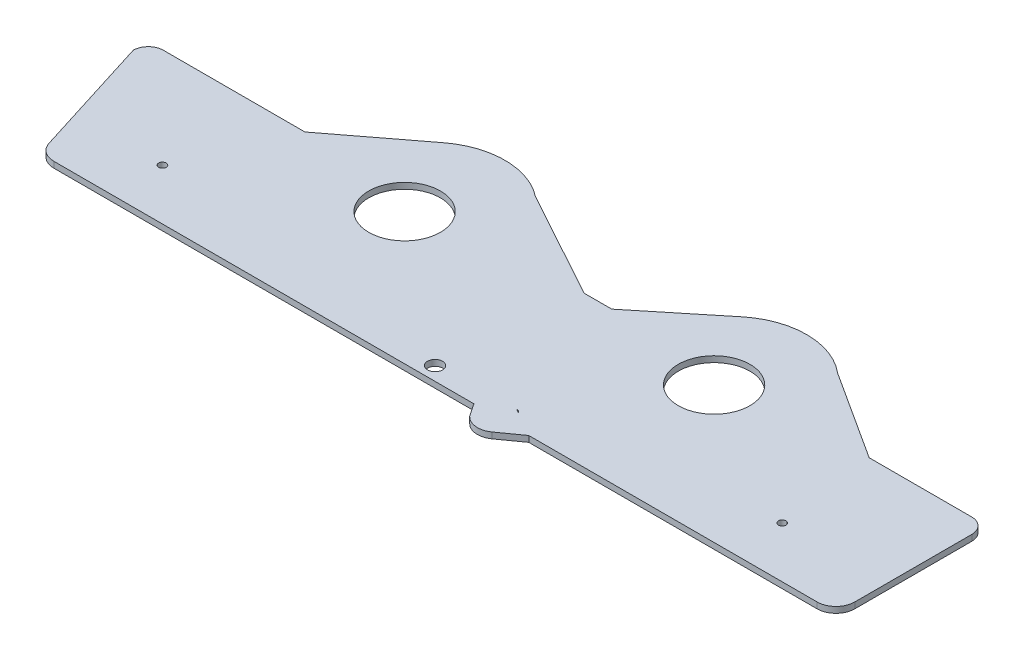
ISO-10303-21;
HEADER;
FILE_DESCRIPTION(('STEP AP214'),'2;1');
FILE_NAME('part.step','',(''),(''),'','','');
FILE_SCHEMA(('AUTOMOTIVE_DESIGN { 1 0 10303 214 1 1 1 1 }'));
ENDSEC;
DATA;
#1=APPLICATION_CONTEXT('core data for automotive mechanical design processes');
#2=APPLICATION_PROTOCOL_DEFINITION('international standard','automotive_design',2000,#1);
#3=PRODUCT_CONTEXT('',#1,'mechanical');
#4=PRODUCT('Part','Part','',(#3));
#5=PRODUCT_RELATED_PRODUCT_CATEGORY('part','',(#4));
#6=PRODUCT_DEFINITION_FORMATION('','',#4);
#7=PRODUCT_DEFINITION_CONTEXT('part definition',#1,'design');
#8=PRODUCT_DEFINITION('design','',#6,#7);
#9=PRODUCT_DEFINITION_SHAPE('','',#8);
#10=(LENGTH_UNIT() NAMED_UNIT(*) SI_UNIT(.MILLI.,.METRE.));
#11=(NAMED_UNIT(*) PLANE_ANGLE_UNIT() SI_UNIT($,.RADIAN.));
#12=(NAMED_UNIT(*) SI_UNIT($,.STERADIAN.) SOLID_ANGLE_UNIT());
#13=UNCERTAINTY_MEASURE_WITH_UNIT(LENGTH_MEASURE(1.E-05),#10,'distance_accuracy_value','');
#14=(GEOMETRIC_REPRESENTATION_CONTEXT(3) GLOBAL_UNCERTAINTY_ASSIGNED_CONTEXT((#13)) GLOBAL_UNIT_ASSIGNED_CONTEXT((#10,
#11,#12)) REPRESENTATION_CONTEXT('',''));
#15=CARTESIAN_POINT('',(0.,0.,0.));
#16=DIRECTION('',(0.,0.,1.));
#17=DIRECTION('',(1.,0.,0.));
#18=AXIS2_PLACEMENT_3D('',#15,#16,#17);
#19=CARTESIAN_POINT('',(264.5,0.,-70.));
#20=DIRECTION('',(0.,1.,0.));
#21=DIRECTION('',(0.,0.,1.));
#22=AXIS2_PLACEMENT_3D('',#19,#20,#21);
#23=CYLINDRICAL_SURFACE('',#22,10.);
#24=DIRECTION('',(0.,1.,0.));
#25=VECTOR('',#24,1.);
#26=CARTESIAN_POINT('',(270.323640372309,0.,-61.8707188009016));
#27=LINE('',#26,#25);
#28=CARTESIAN_POINT('',(270.323640372309,0.,-61.8707188009016));
#29=VERTEX_POINT('',#28);
#30=CARTESIAN_POINT('',(270.323640372309,3.175,-61.8707188009016));
#31=VERTEX_POINT('',#30);
#32=EDGE_CURVE('E215',#29,#31,#27,.T.);
#33=ORIENTED_EDGE('',*,*,#32,.T.);
#34=CARTESIAN_POINT('',(264.5,3.175,-70.));
#35=DIRECTION('',(0.,1.,0.));
#36=DIRECTION('',(0.,0.,1.));
#37=AXIS2_PLACEMENT_3D('',#34,#35,#36);
#38=CIRCLE('',#37,10.);
#39=CARTESIAN_POINT('',(257.164027826321,3.175,-63.204154779058));
#40=VERTEX_POINT('',#39);
#41=EDGE_CURVE('E58',#31,#40,#38,.F.);
#42=ORIENTED_EDGE('',*,*,#41,.T.);
#43=DIRECTION('',(0.,1.,0.));
#44=VECTOR('',#43,1.);
#45=CARTESIAN_POINT('',(257.164027826321,0.,-63.204154779058));
#46=LINE('',#45,#44);
#47=CARTESIAN_POINT('',(257.164027826321,0.,-63.204154779058));
#48=VERTEX_POINT('',#47);
#49=EDGE_CURVE('E230',#48,#40,#46,.T.);
#50=ORIENTED_EDGE('',*,*,#49,.F.);
#51=CARTESIAN_POINT('',(264.5,0.,-70.));
#52=DIRECTION('',(0.,1.,0.));
#53=DIRECTION('',(0.,0.,1.));
#54=AXIS2_PLACEMENT_3D('',#51,#52,#53);
#55=CIRCLE('',#54,10.);
#56=EDGE_CURVE('E538',#48,#29,#55,.T.);
#57=ORIENTED_EDGE('',*,*,#56,.T.);
#58=EDGE_LOOP('',(#33,#42,#50,#57));
#59=FACE_BOUND('',#58,.T.);
#60=ADVANCED_FACE('F43',(#59),#23,.T.);
#61=CARTESIAN_POINT('',(206.258119686764,0.,-138.832894737649));
#62=DIRECTION('',(-0.82957784665794,0.,0.558391078308362));
#63=DIRECTION('',(0.558391078308362,0.,0.82957784665794));
#64=AXIS2_PLACEMENT_3D('',#61,#62,#63);
#65=PLANE('',#64);
#66=ORIENTED_EDGE('',*,*,#49,.T.);
#67=DIRECTION('',(-0.558391078308362,0.,-0.82957784665794));
#68=VECTOR('',#67,1.);
#69=CARTESIAN_POINT('',(206.258119686764,3.175,-138.832894737649));
#70=LINE('',#69,#68);
#71=CARTESIAN_POINT('',(252.589726142366,3.175,-70.));
#72=VERTEX_POINT('',#71);
#73=EDGE_CURVE('E464',#40,#72,#70,.T.);
#74=ORIENTED_EDGE('',*,*,#73,.T.);
#75=DIRECTION('',(0.,1.,0.));
#76=VECTOR('',#75,1.);
#77=CARTESIAN_POINT('',(252.589726142366,0.,-70.));
#78=LINE('',#77,#76);
#79=CARTESIAN_POINT('',(252.589726142366,0.,-70.));
#80=VERTEX_POINT('',#79);
#81=EDGE_CURVE('E521',#80,#72,#78,.T.);
#82=ORIENTED_EDGE('',*,*,#81,.F.);
#83=DIRECTION('',(0.558391078308362,0.,0.82957784665794));
#84=VECTOR('',#83,1.);
#85=CARTESIAN_POINT('',(206.258119686764,0.,-138.832894737649));
#86=LINE('',#85,#84);
#87=EDGE_CURVE('E221',#80,#48,#86,.T.);
#88=ORIENTED_EDGE('',*,*,#87,.T.);
#89=EDGE_LOOP('',(#66,#74,#82,#88));
#90=FACE_BOUND('',#89,.T.);
#91=ADVANCED_FACE('F442',(#90),#65,.T.);
#92=CARTESIAN_POINT('',(101.776463936064,0.,-174.764335414678));
#93=DIRECTION('',(-0.503245940608634,0.,0.864143230755718));
#94=DIRECTION('',(0.864143230755718,0.,0.503245940608634));
#95=AXIS2_PLACEMENT_3D('',#92,#93,#94);
#96=PLANE('',#95);
#97=DIRECTION('',(-0.864143230755718,0.,-0.503245940608634));
#98=VECTOR('',#97,1.);
#99=CARTESIAN_POINT('',(101.776463936064,3.175,-174.764335414678));
#100=LINE('',#99,#98);
#101=CARTESIAN_POINT('',(268.849345076715,3.175,-77.4670978418141));
#102=VERTEX_POINT('',#101);
#103=CARTESIAN_POINT('',(266.045546336288,3.175,-79.0999293958723));
#104=VERTEX_POINT('',#103);
#105=EDGE_CURVE('E459',#102,#104,#100,.T.);
#106=ORIENTED_EDGE('',*,*,#105,.F.);
#107=DIRECTION('',(0.,1.,0.));
#108=VECTOR('',#107,1.);
#109=CARTESIAN_POINT('',(268.849345076715,0.,-77.4670978418142));
#110=LINE('',#109,#108);
#111=CARTESIAN_POINT('',(268.849345076715,0.,-77.4670978418141));
#112=VERTEX_POINT('',#111);
#113=EDGE_CURVE('E214',#112,#102,#110,.T.);
#114=ORIENTED_EDGE('',*,*,#113,.F.);
#115=DIRECTION('',(0.864143230755718,0.,0.503245940608634));
#116=VECTOR('',#115,1.);
#117=CARTESIAN_POINT('',(101.776463936064,0.,-174.764335414678));
#118=LINE('',#117,#116);
#119=CARTESIAN_POINT('',(266.045546336288,0.,-79.0999293958722));
#120=VERTEX_POINT('',#119);
#121=EDGE_CURVE('E540',#120,#112,#118,.T.);
#122=ORIENTED_EDGE('',*,*,#121,.F.);
#123=DIRECTION('',(0.,1.,0.));
#124=VECTOR('',#123,1.);
#125=CARTESIAN_POINT('',(266.045546336288,0.,-79.0999293958723));
#126=LINE('',#125,#124);
#127=EDGE_CURVE('E66',#120,#104,#126,.T.);
#128=ORIENTED_EDGE('',*,*,#127,.T.);
#129=EDGE_LOOP('',(#106,#114,#122,#128));
#130=FACE_BOUND('',#129,.T.);
#131=ADVANCED_FACE('F447',(#130),#96,.F.);
#132=CARTESIAN_POINT('',(62.3888453469937,0.,87.0892491789818));
#133=DIRECTION('',(-0.582364037230876,0.,-0.812928119909844));
#134=DIRECTION('',(-0.812928119909844,0.,0.582364037230876));
#135=AXIS2_PLACEMENT_3D('',#132,#133,#134);
#136=PLANE('',#135);
#137=DIRECTION('',(0.812928119909844,0.,-0.582364037230876));
#138=VECTOR('',#137,1.);
#139=CARTESIAN_POINT('',(62.3888453469937,3.175,87.0892491789818));
#140=LINE('',#139,#138);
#141=CARTESIAN_POINT('',(281.671389990958,3.175,-70.));
#142=VERTEX_POINT('',#141);
#143=EDGE_CURVE('E11',#31,#142,#140,.T.);
#144=ORIENTED_EDGE('',*,*,#143,.F.);
#145=ORIENTED_EDGE('',*,*,#32,.F.);
#146=DIRECTION('',(-0.812928119909844,0.,0.582364037230877));
#147=VECTOR('',#146,1.);
#148=CARTESIAN_POINT('',(62.3888453469937,0.,87.0892491789818));
#149=LINE('',#148,#147);
#150=CARTESIAN_POINT('',(281.671389990958,0.,-70.));
#151=VERTEX_POINT('',#150);
#152=EDGE_CURVE('E212',#151,#29,#149,.T.);
#153=ORIENTED_EDGE('',*,*,#152,.F.);
#154=DIRECTION('',(0.,1.,0.));
#155=VECTOR('',#154,1.);
#156=CARTESIAN_POINT('',(281.671389990958,0.,-70.));
#157=LINE('',#156,#155);
#158=EDGE_CURVE('E203',#151,#142,#157,.T.);
#159=ORIENTED_EDGE('',*,*,#158,.T.);
#160=EDGE_LOOP('',(#144,#145,#153,#159));
#161=FACE_BOUND('',#160,.T.);
#162=ADVANCED_FACE('F211',(#161),#136,.F.);
#163=CARTESIAN_POINT('',(265.281257273604,3.175,-74.5638669813256));
#164=DIRECTION('',(0.,-1.,0.));
#165=DIRECTION('',(0.,0.,-1.));
#166=AXIS2_PLACEMENT_3D('',#163,#164,#165);
#167=CYLINDRICAL_SURFACE('',#166,4.60000000000001);
#168=CARTESIAN_POINT('',(265.281257273604,3.175,-74.5638669813256));
#169=DIRECTION('',(0.,1.,0.));
#170=DIRECTION('',(0.,0.,1.));
#171=AXIS2_PLACEMENT_3D('',#168,#169,#170);
#172=CIRCLE('',#171,4.60000000000001);
#173=EDGE_CURVE('E342',#102,#104,#172,.T.);
#174=ORIENTED_EDGE('',*,*,#173,.T.);
#175=ORIENTED_EDGE('',*,*,#127,.F.);
#176=CARTESIAN_POINT('',(265.281257273604,0.,-74.5638669813256));
#177=DIRECTION('',(0.,1.,0.));
#178=DIRECTION('',(0.,0.,1.));
#179=AXIS2_PLACEMENT_3D('',#176,#177,#178);
#180=CIRCLE('',#179,4.60000000000001);
#181=EDGE_CURVE('E326',#112,#120,#180,.T.);
#182=ORIENTED_EDGE('',*,*,#181,.F.);
#183=ORIENTED_EDGE('',*,*,#113,.T.);
#184=EDGE_LOOP('',(#174,#175,#182,#183));
#185=FACE_BOUND('',#184,.T.);
#186=ADVANCED_FACE('F453',(#185),#167,.F.);
#187=CARTESIAN_POINT('',(0.,0.,-70.));
#188=DIRECTION('',(0.,0.,1.));
#189=DIRECTION('',(1.,0.,0.));
#190=AXIS2_PLACEMENT_3D('',#187,#188,#189);
#191=PLANE('',#190);
#192=DIRECTION('',(1.,0.,0.));
#193=VECTOR('',#192,1.);
#194=CARTESIAN_POINT('',(0.,3.175,-70.));
#195=LINE('',#194,#193);
#196=CARTESIAN_POINT('',(434.5,3.175,-70.));
#197=VERTEX_POINT('',#196);
#198=EDGE_CURVE('E193',#142,#197,#195,.T.);
#199=ORIENTED_EDGE('',*,*,#198,.F.);
#200=ORIENTED_EDGE('',*,*,#158,.F.);
#201=DIRECTION('',(1.,0.,0.));
#202=VECTOR('',#201,1.);
#203=CARTESIAN_POINT('',(0.,0.,-70.));
#204=LINE('',#203,#202);
#205=CARTESIAN_POINT('',(434.5,0.,-70.));
#206=VERTEX_POINT('',#205);
#207=EDGE_CURVE('E382',#151,#206,#204,.T.);
#208=ORIENTED_EDGE('',*,*,#207,.T.);
#209=DIRECTION('',(0.,1.,0.));
#210=VECTOR('',#209,1.);
#211=CARTESIAN_POINT('',(434.5,3.175,-70.));
#212=LINE('',#211,#210);
#213=EDGE_CURVE('E206',#206,#197,#212,.T.);
#214=ORIENTED_EDGE('',*,*,#213,.T.);
#215=EDGE_LOOP('',(#199,#200,#208,#214));
#216=FACE_BOUND('',#215,.T.);
#217=ADVANCED_FACE('F202',(#216),#191,.T.);
#218=CARTESIAN_POINT('',(0.,3.175,-150.));
#219=DIRECTION('',(0.,0.,-1.));
#220=DIRECTION('',(-1.,0.,0.));
#221=AXIS2_PLACEMENT_3D('',#218,#219,#220);
#222=PLANE('',#221);
#223=DIRECTION('',(1.,0.,0.));
#224=VECTOR('',#223,1.);
#225=CARTESIAN_POINT('',(0.,0.,-150.));
#226=LINE('',#225,#224);
#227=CARTESIAN_POINT('',(382.106475607173,0.,-150.));
#228=VERTEX_POINT('',#227);
#229=CARTESIAN_POINT('',(436.5,0.,-150.));
#230=VERTEX_POINT('',#229);
#231=EDGE_CURVE('E351',#228,#230,#226,.T.);
#232=ORIENTED_EDGE('',*,*,#231,.F.);
#233=DIRECTION('',(0.,-1.,0.));
#234=VECTOR('',#233,1.);
#235=CARTESIAN_POINT('',(382.106475607173,3.175,-150.));
#236=LINE('',#235,#234);
#237=CARTESIAN_POINT('',(382.106475607173,3.175,-150.));
#238=VERTEX_POINT('',#237);
#239=EDGE_CURVE('E240',#238,#228,#236,.T.);
#240=ORIENTED_EDGE('',*,*,#239,.F.);
#241=DIRECTION('',(1.,0.,0.));
#242=VECTOR('',#241,1.);
#243=CARTESIAN_POINT('',(0.,3.175,-150.));
#244=LINE('',#243,#242);
#245=CARTESIAN_POINT('',(436.5,3.175,-150.));
#246=VERTEX_POINT('',#245);
#247=EDGE_CURVE('E327',#238,#246,#244,.T.);
#248=ORIENTED_EDGE('',*,*,#247,.T.);
#249=DIRECTION('',(0.,-1.,0.));
#250=VECTOR('',#249,1.);
#251=CARTESIAN_POINT('',(436.5,3.175,-150.));
#252=LINE('',#251,#250);
#253=EDGE_CURVE('E345',#246,#230,#252,.T.);
#254=ORIENTED_EDGE('',*,*,#253,.T.);
#255=EDGE_LOOP('',(#232,#240,#248,#254));
#256=FACE_BOUND('',#255,.T.);
#257=ADVANCED_FACE('F491',(#256),#222,.T.);
#258=CARTESIAN_POINT('',(309.,3.175,-150.));
#259=DIRECTION('',(0.,-1.,0.));
#260=DIRECTION('',(0.,0.,-1.));
#261=AXIS2_PLACEMENT_3D('',#258,#259,#260);
#262=CYLINDRICAL_SURFACE('',#261,40.);
#263=DIRECTION('',(0.,-1.,0.));
#264=VECTOR('',#263,1.);
#265=CARTESIAN_POINT('',(283.734164599155,3.175,-181.010281544955));
#266=LINE('',#265,#264);
#267=CARTESIAN_POINT('',(283.734164599155,3.175,-181.010281544955));
#268=VERTEX_POINT('',#267);
#269=CARTESIAN_POINT('',(283.734164599155,0.,-181.010281544955));
#270=VERTEX_POINT('',#269);
#271=EDGE_CURVE('E264',#268,#270,#266,.T.);
#272=ORIENTED_EDGE('',*,*,#271,.F.);
#273=CARTESIAN_POINT('',(309.,3.175,-150.));
#274=DIRECTION('',(0.,1.,0.));
#275=DIRECTION('',(0.,0.,1.));
#276=AXIS2_PLACEMENT_3D('',#273,#274,#275);
#277=CIRCLE('',#276,40.);
#278=CARTESIAN_POINT('',(334.871034878903,3.175,-180.507204957101));
#279=VERTEX_POINT('',#278);
#280=EDGE_CURVE('E249',#279,#268,#277,.T.);
#281=ORIENTED_EDGE('',*,*,#280,.F.);
#282=DIRECTION('',(0.,-1.,0.));
#283=VECTOR('',#282,1.);
#284=CARTESIAN_POINT('',(334.871034878903,3.175,-180.507204957101));
#285=LINE('',#284,#283);
#286=CARTESIAN_POINT('',(334.871034878903,0.,-180.507204957101));
#287=VERTEX_POINT('',#286);
#288=EDGE_CURVE('E52',#287,#279,#285,.F.);
#289=ORIENTED_EDGE('',*,*,#288,.F.);
#290=CARTESIAN_POINT('',(309.,0.,-150.));
#291=DIRECTION('',(0.,1.,0.));
#292=DIRECTION('',(0.,0.,1.));
#293=AXIS2_PLACEMENT_3D('',#290,#291,#292);
#294=CIRCLE('',#293,40.);
#295=EDGE_CURVE('E248',#287,#270,#294,.T.);
#296=ORIENTED_EDGE('',*,*,#295,.T.);
#297=EDGE_LOOP('',(#272,#281,#289,#296));
#298=FACE_BOUND('',#297,.T.);
#299=ADVANCED_FACE('F571',(#298),#262,.T.);
#300=CARTESIAN_POINT('',(231.01461959859,3.175,-150.));
#301=VERTEX_POINT('',#300);
#302=CARTESIAN_POINT('',(245.673378314399,3.175,-150.));
#303=VERTEX_POINT('',#302);
#304=EDGE_CURVE('E328',#301,#303,#244,.T.);
#305=ORIENTED_EDGE('',*,*,#304,.T.);
#306=DIRECTION('',(0.,-1.,0.));
#307=VECTOR('',#306,1.);
#308=CARTESIAN_POINT('',(245.673378314399,3.175,-150.));
#309=LINE('',#308,#307);
#310=CARTESIAN_POINT('',(245.673378314399,0.,-150.));
#311=VERTEX_POINT('',#310);
#312=EDGE_CURVE('E256',#303,#311,#309,.T.);
#313=ORIENTED_EDGE('',*,*,#312,.T.);
#314=CARTESIAN_POINT('',(231.01461959859,0.,-150.));
#315=VERTEX_POINT('',#314);
#316=EDGE_CURVE('E352',#315,#311,#226,.T.);
#317=ORIENTED_EDGE('',*,*,#316,.F.);
#318=DIRECTION('',(0.,1.,0.));
#319=VECTOR('',#318,1.);
#320=CARTESIAN_POINT('',(231.01461959859,3.175,-150.));
#321=LINE('',#320,#319);
#322=EDGE_CURVE('E292',#315,#301,#321,.T.);
#323=ORIENTED_EDGE('',*,*,#322,.T.);
#324=EDGE_LOOP('',(#305,#313,#317,#323));
#325=FACE_BOUND('',#324,.T.);
#326=ADVANCED_FACE('F489',(#325),#222,.T.);
#327=CARTESIAN_POINT('',(8.,3.175,-150.));
#328=VERTEX_POINT('',#327);
#329=CARTESIAN_POINT('',(83.029725003325,3.175,-150.));
#330=VERTEX_POINT('',#329);
#331=EDGE_CURVE('E322',#328,#330,#244,.T.);
#332=ORIENTED_EDGE('',*,*,#331,.T.);
#333=DIRECTION('',(0.,-1.,0.));
#334=VECTOR('',#333,1.);
#335=CARTESIAN_POINT('',(83.0297250033249,3.175,-150.));
#336=LINE('',#335,#334);
#337=CARTESIAN_POINT('',(83.029725003325,0.,-150.));
#338=VERTEX_POINT('',#337);
#339=EDGE_CURVE('E295',#330,#338,#336,.T.);
#340=ORIENTED_EDGE('',*,*,#339,.T.);
#341=CARTESIAN_POINT('',(8.,0.,-150.));
#342=VERTEX_POINT('',#341);
#343=EDGE_CURVE('E346',#342,#338,#226,.T.);
#344=ORIENTED_EDGE('',*,*,#343,.F.);
#345=DIRECTION('',(0.,-1.,0.));
#346=VECTOR('',#345,1.);
#347=CARTESIAN_POINT('',(8.,3.175,-150.));
#348=LINE('',#347,#346);
#349=EDGE_CURVE('E379',#328,#342,#348,.T.);
#350=ORIENTED_EDGE('',*,*,#349,.F.);
#351=EDGE_LOOP('',(#332,#340,#344,#350));
#352=FACE_BOUND('',#351,.T.);
#353=ADVANCED_FACE('F485',(#352),#222,.T.);
#354=CARTESIAN_POINT('',(149.,3.175,-150.040398610273));
#355=DIRECTION('',(0.,-1.,0.));
#356=DIRECTION('',(0.,0.,-1.));
#357=AXIS2_PLACEMENT_3D('',#354,#355,#356);
#358=CYLINDRICAL_SURFACE('',#357,40.);
#359=DIRECTION('',(0.,-1.,0.));
#360=VECTOR('',#359,1.);
#361=CARTESIAN_POINT('',(124.164543782823,3.175,-181.39642059146));
#362=LINE('',#361,#360);
#363=CARTESIAN_POINT('',(124.164543782823,3.175,-181.39642059146));
#364=VERTEX_POINT('',#363);
#365=CARTESIAN_POINT('',(124.164543782823,0.,-181.39642059146));
#366=VERTEX_POINT('',#365);
#367=EDGE_CURVE('E288',#364,#366,#362,.T.);
#368=ORIENTED_EDGE('',*,*,#367,.F.);
#369=CARTESIAN_POINT('',(149.,3.175,-150.040398610273));
#370=DIRECTION('',(0.,1.,0.));
#371=DIRECTION('',(0.,0.,1.));
#372=AXIS2_PLACEMENT_3D('',#369,#370,#371);
#373=CIRCLE('',#372,40.);
#374=CARTESIAN_POINT('',(173.835456217177,3.175,-181.39642059146));
#375=VERTEX_POINT('',#374);
#376=EDGE_CURVE('E299',#375,#364,#373,.T.);
#377=ORIENTED_EDGE('',*,*,#376,.F.);
#378=DIRECTION('',(0.,-1.,0.));
#379=VECTOR('',#378,1.);
#380=CARTESIAN_POINT('',(173.835456217177,3.175,-181.39642059146));
#381=LINE('',#380,#379);
#382=CARTESIAN_POINT('',(173.835456217177,0.,-181.39642059146));
#383=VERTEX_POINT('',#382);
#384=EDGE_CURVE('E278',#375,#383,#381,.T.);
#385=ORIENTED_EDGE('',*,*,#384,.T.);
#386=CARTESIAN_POINT('',(149.,0.,-150.040398610273));
#387=DIRECTION('',(0.,1.,0.));
#388=DIRECTION('',(0.,0.,1.));
#389=AXIS2_PLACEMENT_3D('',#386,#387,#388);
#390=CIRCLE('',#389,40.);
#391=EDGE_CURVE('E298',#383,#366,#390,.T.);
#392=ORIENTED_EDGE('',*,*,#391,.T.);
#393=EDGE_LOOP('',(#368,#377,#385,#392));
#394=FACE_BOUND('',#393,.T.);
#395=ADVANCED_FACE('F488',(#394),#358,.T.);
#396=CARTESIAN_POINT('',(40.5261663286004,3.175,-12.7022312373225));
#397=DIRECTION('',(0.954226213925607,0.,-0.29908582824534));
#398=DIRECTION('',(-0.29908582824534,0.,-0.954226213925608));
#399=AXIS2_PLACEMENT_3D('',#396,#397,#398);
#400=PLANE('',#399);
#401=DIRECTION('',(0.29908582824534,0.,0.954226213925608));
#402=VECTOR('',#401,1.);
#403=CARTESIAN_POINT('',(40.5261663286004,0.,-12.7022312373225));
#404=LINE('',#403,#402);
#405=CARTESIAN_POINT('',(0.,0.,-142.));
#406=VERTEX_POINT('',#405);
#407=CARTESIAN_POINT('',(20.3702690139033,0.,-77.0091417175466));
#408=VERTEX_POINT('',#407);
#409=EDGE_CURVE('E355',#406,#408,#404,.T.);
#410=ORIENTED_EDGE('',*,*,#409,.T.);
#411=DIRECTION('',(0.,-1.,0.));
#412=VECTOR('',#411,1.);
#413=CARTESIAN_POINT('',(20.3702690139033,3.175,-77.0091417175466));
#414=LINE('',#413,#412);
#415=CARTESIAN_POINT('',(20.3702690139033,3.175,-77.0091417175466));
#416=VERTEX_POINT('',#415);
#417=EDGE_CURVE('E393',#408,#416,#414,.F.);
#418=ORIENTED_EDGE('',*,*,#417,.T.);
#419=DIRECTION('',(0.29908582824534,0.,0.954226213925608));
#420=VECTOR('',#419,1.);
#421=CARTESIAN_POINT('',(40.5261663286004,3.175,-12.7022312373225));
#422=LINE('',#421,#420);
#423=CARTESIAN_POINT('',(0.,3.175,-142.));
#424=VERTEX_POINT('',#423);
#425=EDGE_CURVE('E331',#424,#416,#422,.T.);
#426=ORIENTED_EDGE('',*,*,#425,.F.);
#427=DIRECTION('',(0.,-1.,0.));
#428=VECTOR('',#427,1.);
#429=CARTESIAN_POINT('',(0.,3.175,-142.));
#430=LINE('',#429,#428);
#431=EDGE_CURVE('E375',#424,#406,#430,.T.);
#432=ORIENTED_EDGE('',*,*,#431,.T.);
#433=EDGE_LOOP('',(#410,#418,#426,#432));
#434=FACE_BOUND('',#433,.T.);
#435=ADVANCED_FACE('F477',(#434),#400,.F.);
#436=CARTESIAN_POINT('',(444.5,3.175,0.));
#437=DIRECTION('',(-1.,0.,0.));
#438=DIRECTION('',(0.,0.,1.));
#439=AXIS2_PLACEMENT_3D('',#436,#437,#438);
#440=PLANE('',#439);
#441=DIRECTION('',(0.,0.,-1.));
#442=VECTOR('',#441,1.);
#443=CARTESIAN_POINT('',(444.5,3.175,0.));
#444=LINE('',#443,#442);
#445=CARTESIAN_POINT('',(444.5,3.175,-80.));
#446=VERTEX_POINT('',#445);
#447=CARTESIAN_POINT('',(444.5,3.175,-142.));
#448=VERTEX_POINT('',#447);
#449=EDGE_CURVE('E335',#446,#448,#444,.T.);
#450=ORIENTED_EDGE('',*,*,#449,.F.);
#451=DIRECTION('',(0.,1.,0.));
#452=VECTOR('',#451,1.);
#453=CARTESIAN_POINT('',(444.5,0.,-80.));
#454=LINE('',#453,#452);
#455=CARTESIAN_POINT('',(444.5,0.,-80.));
#456=VERTEX_POINT('',#455);
#457=EDGE_CURVE('E404',#446,#456,#454,.F.);
#458=ORIENTED_EDGE('',*,*,#457,.T.);
#459=DIRECTION('',(0.,0.,-1.));
#460=VECTOR('',#459,1.);
#461=CARTESIAN_POINT('',(444.5,0.,0.));
#462=LINE('',#461,#460);
#463=CARTESIAN_POINT('',(444.5,0.,-142.));
#464=VERTEX_POINT('',#463);
#465=EDGE_CURVE('E359',#456,#464,#462,.T.);
#466=ORIENTED_EDGE('',*,*,#465,.T.);
#467=DIRECTION('',(0.,-1.,0.));
#468=VECTOR('',#467,1.);
#469=CARTESIAN_POINT('',(444.5,3.175,-142.));
#470=LINE('',#469,#468);
#471=EDGE_CURVE('E371',#448,#464,#470,.T.);
#472=ORIENTED_EDGE('',*,*,#471,.F.);
#473=EDGE_LOOP('',(#450,#458,#466,#472));
#474=FACE_BOUND('',#473,.T.);
#475=ADVANCED_FACE('F468',(#474),#440,.F.);
#476=CARTESIAN_POINT('',(0.,3.175,0.));
#477=DIRECTION('',(0.,1.,0.));
#478=DIRECTION('',(0.,0.,1.));
#479=AXIS2_PLACEMENT_3D('',#476,#477,#478);
#480=PLANE('',#479);
#481=CARTESIAN_POINT('',(29.9125311531594,3.175,-70.));
#482=VERTEX_POINT('',#481);
#483=EDGE_CURVE('E208',#482,#72,#195,.T.);
#484=ORIENTED_EDGE('',*,*,#483,.T.);
#485=ORIENTED_EDGE('',*,*,#73,.F.);
#486=ORIENTED_EDGE('',*,*,#41,.F.);
#487=ORIENTED_EDGE('',*,*,#143,.T.);
#488=ORIENTED_EDGE('',*,*,#198,.T.);
#489=CARTESIAN_POINT('',(434.5,3.175,-80.));
#490=DIRECTION('',(0.,1.,0.));
#491=DIRECTION('',(0.,0.,1.));
#492=AXIS2_PLACEMENT_3D('',#489,#490,#491);
#493=CIRCLE('',#492,10.);
#494=EDGE_CURVE('E401',#197,#446,#493,.T.);
#495=ORIENTED_EDGE('',*,*,#494,.T.);
#496=ORIENTED_EDGE('',*,*,#449,.T.);
#497=CARTESIAN_POINT('',(436.5,3.175,-142.));
#498=DIRECTION('',(0.,1.,0.));
#499=DIRECTION('',(0.,0.,1.));
#500=AXIS2_PLACEMENT_3D('',#497,#498,#499);
#501=CIRCLE('',#500,7.99999999999999);
#502=EDGE_CURVE('E338',#448,#246,#501,.T.);
#503=ORIENTED_EDGE('',*,*,#502,.T.);
#504=ORIENTED_EDGE('',*,*,#247,.F.);
#505=DIRECTION('',(-0.840031412026268,0.,-0.542537765329893));
#506=VECTOR('',#505,1.);
#507=CARTESIAN_POINT('',(326.166341834622,3.175,-186.129166998658));
#508=LINE('',#507,#506);
#509=EDGE_CURVE('E236',#238,#279,#508,.T.);
#510=ORIENTED_EDGE('',*,*,#509,.T.);
#511=ORIENTED_EDGE('',*,*,#280,.T.);
#512=DIRECTION('',(-0.775257038623885,0.,0.631645885021129));
#513=VECTOR('',#512,1.);
#514=CARTESIAN_POINT('',(24.5647227929031,3.175,30.1497638133203));
#515=LINE('',#514,#513);
#516=EDGE_CURVE('E252',#268,#303,#515,.T.);
#517=ORIENTED_EDGE('',*,*,#516,.T.);
#518=ORIENTED_EDGE('',*,*,#304,.F.);
#519=DIRECTION('',(-0.876553077336371,0.,-0.48130520733952));
#520=VECTOR('',#519,1.);
#521=CARTESIAN_POINT('',(173.835456217177,3.175,-181.39642059146));
#522=LINE('',#521,#520);
#523=EDGE_CURVE('E273',#301,#375,#522,.T.);
#524=ORIENTED_EDGE('',*,*,#523,.T.);
#525=ORIENTED_EDGE('',*,*,#376,.T.);
#526=DIRECTION('',(-0.794913416528383,0.,0.606722885857435));
#527=VECTOR('',#526,1.);
#528=CARTESIAN_POINT('',(124.164543782823,3.175,-181.39642059146));
#529=LINE('',#528,#527);
#530=EDGE_CURVE('E269',#364,#330,#529,.T.);
#531=ORIENTED_EDGE('',*,*,#530,.T.);
#532=ORIENTED_EDGE('',*,*,#331,.F.);
#533=CARTESIAN_POINT('',(8.,3.175,-142.));
#534=DIRECTION('',(0.,1.,0.));
#535=DIRECTION('',(0.,0.,1.));
#536=AXIS2_PLACEMENT_3D('',#533,#534,#535);
#537=CIRCLE('',#536,8.);
#538=EDGE_CURVE('E325',#328,#424,#537,.T.);
#539=ORIENTED_EDGE('',*,*,#538,.T.);
#540=ORIENTED_EDGE('',*,*,#425,.T.);
#541=CARTESIAN_POINT('',(29.9125311531594,3.175,-80.));
#542=DIRECTION('',(0.,1.,0.));
#543=DIRECTION('',(0.,0.,1.));
#544=AXIS2_PLACEMENT_3D('',#541,#542,#543);
#545=CIRCLE('',#544,10.);
#546=EDGE_CURVE('E396',#416,#482,#545,.T.);
#547=ORIENTED_EDGE('',*,*,#546,.T.);
#548=EDGE_LOOP('',(#484,#485,#486,#487,#488,#495,#496,#503,#504,#510,#511,#517,#518,#524,#525,
#531,#532,#539,#540,#547));
#549=FACE_BOUND('',#548,.T.);
#550=CARTESIAN_POINT('',(307.606475607173,3.175,-142.29806447673));
#551=DIRECTION('',(0.,1.,0.));
#552=DIRECTION('',(0.,0.,1.));
#553=AXIS2_PLACEMENT_3D('',#550,#551,#552);
#554=CIRCLE('',#553,19.);
#555=CARTESIAN_POINT('',(307.606475607173,3.175,-123.29806447673));
#556=VERTEX_POINT('',#555);
#557=EDGE_CURVE('E225',#556,#556,#554,.T.);
#558=ORIENTED_EDGE('',*,*,#557,.F.);
#559=EDGE_LOOP('',(#558));
#560=FACE_BOUND('',#559,.T.);
#561=CARTESIAN_POINT('',(146.,3.175,-139.840398610273));
#562=DIRECTION('',(0.,1.,0.));
#563=DIRECTION('',(0.,0.,1.));
#564=AXIS2_PLACEMENT_3D('',#561,#562,#563);
#565=CIRCLE('',#564,19.);
#566=CARTESIAN_POINT('',(146.,3.175,-120.840398610273));
#567=VERTEX_POINT('',#566);
#568=EDGE_CURVE('E231',#567,#567,#565,.T.);
#569=ORIENTED_EDGE('',*,*,#568,.F.);
#570=EDGE_LOOP('',(#569));
#571=FACE_BOUND('',#570,.T.);
#572=CARTESIAN_POINT('',(389.,3.175,-97.));
#573=DIRECTION('',(0.,1.,0.));
#574=DIRECTION('',(0.,0.,1.));
#575=AXIS2_PLACEMENT_3D('',#572,#573,#574);
#576=CIRCLE('',#575,2.);
#577=CARTESIAN_POINT('',(389.,3.175,-95.));
#578=VERTEX_POINT('',#577);
#579=EDGE_CURVE('E303',#578,#578,#576,.T.);
#580=ORIENTED_EDGE('',*,*,#579,.F.);
#581=EDGE_LOOP('',(#580));
#582=FACE_BOUND('',#581,.T.);
#583=CARTESIAN_POINT('',(60.5,3.175,-97.));
#584=DIRECTION('',(0.,1.,0.));
#585=DIRECTION('',(0.,0.,1.));
#586=AXIS2_PLACEMENT_3D('',#583,#584,#585);
#587=CIRCLE('',#586,2.);
#588=CARTESIAN_POINT('',(60.5,3.175,-95.));
#589=VERTEX_POINT('',#588);
#590=EDGE_CURVE('E315',#589,#589,#587,.T.);
#591=ORIENTED_EDGE('',*,*,#590,.F.);
#592=EDGE_LOOP('',(#591));
#593=FACE_BOUND('',#592,.T.);
#594=CARTESIAN_POINT('',(224.75,3.175,-77.255));
#595=DIRECTION('',(0.,1.,0.));
#596=DIRECTION('',(0.,0.,1.));
#597=AXIS2_PLACEMENT_3D('',#594,#595,#596);
#598=CIRCLE('',#597,3.99083763901675);
#599=CARTESIAN_POINT('',(224.75,3.175,-73.2641623609833));
#600=VERTEX_POINT('',#599);
#601=EDGE_CURVE('E314',#600,#600,#598,.T.);
#602=ORIENTED_EDGE('',*,*,#601,.F.);
#603=EDGE_LOOP('',(#602));
#604=FACE_BOUND('',#603,.T.);
#605=ORIENTED_EDGE('',*,*,#105,.T.);
#606=ORIENTED_EDGE('',*,*,#173,.F.);
#607=EDGE_LOOP('',(#605,#606));
#608=FACE_BOUND('',#607,.T.);
#609=ADVANCED_FACE('F191',(#549,#560,#571,#582,#593,#604,#608),#480,.T.);
#610=CARTESIAN_POINT('',(0.,0.,0.));
#611=DIRECTION('',(0.,1.,0.));
#612=DIRECTION('',(0.,0.,1.));
#613=AXIS2_PLACEMENT_3D('',#610,#611,#612);
#614=PLANE('',#613);
#615=ORIENTED_EDGE('',*,*,#181,.T.);
#616=ORIENTED_EDGE('',*,*,#121,.T.);
#617=EDGE_LOOP('',(#615,#616));
#618=FACE_BOUND('',#617,.T.);
#619=ORIENTED_EDGE('',*,*,#207,.F.);
#620=ORIENTED_EDGE('',*,*,#152,.T.);
#621=ORIENTED_EDGE('',*,*,#56,.F.);
#622=ORIENTED_EDGE('',*,*,#87,.F.);
#623=CARTESIAN_POINT('',(29.9125311531594,0.,-70.));
#624=VERTEX_POINT('',#623);
#625=EDGE_CURVE('E385',#624,#80,#204,.T.);
#626=ORIENTED_EDGE('',*,*,#625,.F.);
#627=CARTESIAN_POINT('',(29.9125311531594,0.,-80.));
#628=DIRECTION('',(0.,1.,0.));
#629=DIRECTION('',(0.,0.,1.));
#630=AXIS2_PLACEMENT_3D('',#627,#628,#629);
#631=CIRCLE('',#630,10.);
#632=EDGE_CURVE('E390',#624,#408,#631,.F.);
#633=ORIENTED_EDGE('',*,*,#632,.T.);
#634=ORIENTED_EDGE('',*,*,#409,.F.);
#635=CARTESIAN_POINT('',(8.,0.,-142.));
#636=DIRECTION('',(0.,1.,0.));
#637=DIRECTION('',(0.,0.,1.));
#638=AXIS2_PLACEMENT_3D('',#635,#636,#637);
#639=CIRCLE('',#638,8.);
#640=EDGE_CURVE('E350',#342,#406,#639,.T.);
#641=ORIENTED_EDGE('',*,*,#640,.F.);
#642=ORIENTED_EDGE('',*,*,#343,.T.);
#643=DIRECTION('',(-0.794913416528383,0.,0.606722885857435));
#644=VECTOR('',#643,1.);
#645=CARTESIAN_POINT('',(124.164543782823,0.,-181.39642059146));
#646=LINE('',#645,#644);
#647=EDGE_CURVE('E268',#366,#338,#646,.T.);
#648=ORIENTED_EDGE('',*,*,#647,.F.);
#649=ORIENTED_EDGE('',*,*,#391,.F.);
#650=DIRECTION('',(-0.876553077336371,0.,-0.48130520733952));
#651=VECTOR('',#650,1.);
#652=CARTESIAN_POINT('',(173.835456217177,0.,-181.39642059146));
#653=LINE('',#652,#651);
#654=EDGE_CURVE('E274',#315,#383,#653,.T.);
#655=ORIENTED_EDGE('',*,*,#654,.F.);
#656=ORIENTED_EDGE('',*,*,#316,.T.);
#657=DIRECTION('',(-0.775257038623885,0.,0.631645885021129));
#658=VECTOR('',#657,1.);
#659=CARTESIAN_POINT('',(24.5647227929031,0.,30.1497638133203));
#660=LINE('',#659,#658);
#661=EDGE_CURVE('E253',#270,#311,#660,.T.);
#662=ORIENTED_EDGE('',*,*,#661,.F.);
#663=ORIENTED_EDGE('',*,*,#295,.F.);
#664=DIRECTION('',(-0.840031412026268,0.,-0.542537765329893));
#665=VECTOR('',#664,1.);
#666=CARTESIAN_POINT('',(326.166341834622,0.,-186.129166998658));
#667=LINE('',#666,#665);
#668=EDGE_CURVE('E241',#228,#287,#667,.T.);
#669=ORIENTED_EDGE('',*,*,#668,.F.);
#670=ORIENTED_EDGE('',*,*,#231,.T.);
#671=CARTESIAN_POINT('',(436.5,0.,-142.));
#672=DIRECTION('',(0.,1.,0.));
#673=DIRECTION('',(0.,0.,1.));
#674=AXIS2_PLACEMENT_3D('',#671,#672,#673);
#675=CIRCLE('',#674,7.99999999999999);
#676=EDGE_CURVE('E362',#464,#230,#675,.T.);
#677=ORIENTED_EDGE('',*,*,#676,.F.);
#678=ORIENTED_EDGE('',*,*,#465,.F.);
#679=CARTESIAN_POINT('',(434.5,0.,-80.));
#680=DIRECTION('',(0.,1.,0.));
#681=DIRECTION('',(0.,0.,1.));
#682=AXIS2_PLACEMENT_3D('',#679,#680,#681);
#683=CIRCLE('',#682,10.);
#684=EDGE_CURVE('E407',#456,#206,#683,.F.);
#685=ORIENTED_EDGE('',*,*,#684,.T.);
#686=EDGE_LOOP('',(#619,#620,#621,#622,#626,#633,#634,#641,#642,#648,#649,#655,#656,#662,#663,
#669,#670,#677,#678,#685));
#687=FACE_BOUND('',#686,.T.);
#688=CARTESIAN_POINT('',(307.606475607173,0.,-142.29806447673));
#689=DIRECTION('',(0.,1.,0.));
#690=DIRECTION('',(0.,0.,1.));
#691=AXIS2_PLACEMENT_3D('',#688,#689,#690);
#692=CIRCLE('',#691,19.);
#693=CARTESIAN_POINT('',(307.606475607173,0.,-123.29806447673));
#694=VERTEX_POINT('',#693);
#695=EDGE_CURVE('E229',#694,#694,#692,.T.);
#696=ORIENTED_EDGE('',*,*,#695,.T.);
#697=EDGE_LOOP('',(#696));
#698=FACE_BOUND('',#697,.T.);
#699=CARTESIAN_POINT('',(146.,0.,-139.840398610273));
#700=DIRECTION('',(0.,1.,0.));
#701=DIRECTION('',(0.,0.,1.));
#702=AXIS2_PLACEMENT_3D('',#699,#700,#701);
#703=CIRCLE('',#702,19.);
#704=CARTESIAN_POINT('',(146.,0.,-120.840398610273));
#705=VERTEX_POINT('',#704);
#706=EDGE_CURVE('E235',#705,#705,#703,.T.);
#707=ORIENTED_EDGE('',*,*,#706,.T.);
#708=EDGE_LOOP('',(#707));
#709=FACE_BOUND('',#708,.T.);
#710=CARTESIAN_POINT('',(224.75,0.,-77.255));
#711=DIRECTION('',(0.,1.,0.));
#712=DIRECTION('',(0.,0.,1.));
#713=AXIS2_PLACEMENT_3D('',#710,#711,#712);
#714=CIRCLE('',#713,3.99083763901675);
#715=CARTESIAN_POINT('',(224.75,0.,-73.2641623609833));
#716=VERTEX_POINT('',#715);
#717=EDGE_CURVE('E209',#716,#716,#714,.T.);
#718=ORIENTED_EDGE('',*,*,#717,.T.);
#719=EDGE_LOOP('',(#718));
#720=FACE_BOUND('',#719,.T.);
#721=CARTESIAN_POINT('',(60.5,0.,-97.));
#722=DIRECTION('',(0.,1.,0.));
#723=DIRECTION('',(0.,0.,1.));
#724=AXIS2_PLACEMENT_3D('',#721,#722,#723);
#725=CIRCLE('',#724,2.);
#726=CARTESIAN_POINT('',(60.5,0.,-95.));
#727=VERTEX_POINT('',#726);
#728=EDGE_CURVE('E310',#727,#727,#725,.T.);
#729=ORIENTED_EDGE('',*,*,#728,.T.);
#730=EDGE_LOOP('',(#729));
#731=FACE_BOUND('',#730,.T.);
#732=CARTESIAN_POINT('',(389.,0.,-97.));
#733=DIRECTION('',(0.,1.,0.));
#734=DIRECTION('',(0.,0.,1.));
#735=AXIS2_PLACEMENT_3D('',#732,#733,#734);
#736=CIRCLE('',#735,2.);
#737=CARTESIAN_POINT('',(389.,0.,-95.));
#738=VERTEX_POINT('',#737);
#739=EDGE_CURVE('E309',#738,#738,#736,.T.);
#740=ORIENTED_EDGE('',*,*,#739,.T.);
#741=EDGE_LOOP('',(#740));
#742=FACE_BOUND('',#741,.T.);
#743=ADVANCED_FACE('F426',(#618,#687,#698,#709,#720,#731,#742),#614,.F.);
#744=CARTESIAN_POINT('',(8.,3.175,-142.));
#745=DIRECTION('',(0.,-1.,0.));
#746=DIRECTION('',(0.,0.,-1.));
#747=AXIS2_PLACEMENT_3D('',#744,#745,#746);
#748=CYLINDRICAL_SURFACE('',#747,8.);
#749=ORIENTED_EDGE('',*,*,#640,.T.);
#750=ORIENTED_EDGE('',*,*,#431,.F.);
#751=ORIENTED_EDGE('',*,*,#538,.F.);
#752=ORIENTED_EDGE('',*,*,#349,.T.);
#753=EDGE_LOOP('',(#749,#750,#751,#752));
#754=FACE_BOUND('',#753,.T.);
#755=ADVANCED_FACE('F474',(#754),#748,.T.);
#756=CARTESIAN_POINT('',(436.5,3.175,-142.));
#757=DIRECTION('',(0.,-1.,0.));
#758=DIRECTION('',(0.,0.,-1.));
#759=AXIS2_PLACEMENT_3D('',#756,#757,#758);
#760=CYLINDRICAL_SURFACE('',#759,7.99999999999999);
#761=ORIENTED_EDGE('',*,*,#676,.T.);
#762=ORIENTED_EDGE('',*,*,#253,.F.);
#763=ORIENTED_EDGE('',*,*,#502,.F.);
#764=ORIENTED_EDGE('',*,*,#471,.T.);
#765=EDGE_LOOP('',(#761,#762,#763,#764));
#766=FACE_BOUND('',#765,.T.);
#767=ADVANCED_FACE('F492',(#766),#760,.T.);
#768=ORIENTED_EDGE('',*,*,#81,.T.);
#769=ORIENTED_EDGE('',*,*,#483,.F.);
#770=DIRECTION('',(0.,-1.,0.));
#771=VECTOR('',#770,1.);
#772=CARTESIAN_POINT('',(29.9125311531594,0.,-70.));
#773=LINE('',#772,#771);
#774=EDGE_CURVE('E386',#482,#624,#773,.T.);
#775=ORIENTED_EDGE('',*,*,#774,.T.);
#776=ORIENTED_EDGE('',*,*,#625,.T.);
#777=EDGE_LOOP('',(#768,#769,#775,#776));
#778=FACE_BOUND('',#777,.T.);
#779=ADVANCED_FACE('F494',(#778),#191,.T.);
#780=CARTESIAN_POINT('',(29.9125311531594,0.,-80.));
#781=DIRECTION('',(0.,1.,0.));
#782=DIRECTION('',(0.,0.,1.));
#783=AXIS2_PLACEMENT_3D('',#780,#781,#782);
#784=CYLINDRICAL_SURFACE('',#783,10.);
#785=ORIENTED_EDGE('',*,*,#546,.F.);
#786=ORIENTED_EDGE('',*,*,#417,.F.);
#787=ORIENTED_EDGE('',*,*,#632,.F.);
#788=ORIENTED_EDGE('',*,*,#774,.F.);
#789=EDGE_LOOP('',(#785,#786,#787,#788));
#790=FACE_BOUND('',#789,.T.);
#791=ADVANCED_FACE('F502',(#790),#784,.T.);
#792=CARTESIAN_POINT('',(434.5,0.,-80.));
#793=DIRECTION('',(0.,-1.,0.));
#794=DIRECTION('',(0.,0.,-1.));
#795=AXIS2_PLACEMENT_3D('',#792,#793,#794);
#796=CYLINDRICAL_SURFACE('',#795,10.);
#797=ORIENTED_EDGE('',*,*,#684,.F.);
#798=ORIENTED_EDGE('',*,*,#457,.F.);
#799=ORIENTED_EDGE('',*,*,#494,.F.);
#800=ORIENTED_EDGE('',*,*,#213,.F.);
#801=EDGE_LOOP('',(#797,#798,#799,#800));
#802=FACE_BOUND('',#801,.T.);
#803=ADVANCED_FACE('F45',(#802),#796,.T.);
#804=CARTESIAN_POINT('',(224.75,-6.825,-77.255));
#805=DIRECTION('',(0.,1.,0.));
#806=DIRECTION('',(0.,0.,1.));
#807=AXIS2_PLACEMENT_3D('',#804,#805,#806);
#808=CYLINDRICAL_SURFACE('',#807,3.99083763901675);
#809=ORIENTED_EDGE('',*,*,#601,.T.);
#810=EDGE_LOOP('',(#809));
#811=FACE_BOUND('',#810,.T.);
#812=ORIENTED_EDGE('',*,*,#717,.F.);
#813=EDGE_LOOP('',(#812));
#814=FACE_BOUND('',#813,.T.);
#815=ADVANCED_FACE('F509',(#811,#814),#808,.F.);
#816=CARTESIAN_POINT('',(60.5,0.,-97.));
#817=DIRECTION('',(0.,1.,0.));
#818=DIRECTION('',(0.,0.,1.));
#819=AXIS2_PLACEMENT_3D('',#816,#817,#818);
#820=CYLINDRICAL_SURFACE('',#819,2.);
#821=ORIENTED_EDGE('',*,*,#728,.F.);
#822=EDGE_LOOP('',(#821));
#823=FACE_BOUND('',#822,.T.);
#824=ORIENTED_EDGE('',*,*,#590,.T.);
#825=EDGE_LOOP('',(#824));
#826=FACE_BOUND('',#825,.T.);
#827=ADVANCED_FACE('F605',(#823,#826),#820,.F.);
#828=CARTESIAN_POINT('',(389.,-6.825,-97.));
#829=DIRECTION('',(0.,1.,0.));
#830=DIRECTION('',(0.,0.,1.));
#831=AXIS2_PLACEMENT_3D('',#828,#829,#830);
#832=CYLINDRICAL_SURFACE('',#831,2.);
#833=ORIENTED_EDGE('',*,*,#579,.T.);
#834=EDGE_LOOP('',(#833));
#835=FACE_BOUND('',#834,.T.);
#836=ORIENTED_EDGE('',*,*,#739,.F.);
#837=EDGE_LOOP('',(#836));
#838=FACE_BOUND('',#837,.T.);
#839=ADVANCED_FACE('F598',(#835,#838),#832,.F.);
#840=CARTESIAN_POINT('',(124.164543782823,3.175,-181.39642059146));
#841=DIRECTION('',(0.606722885857435,0.,0.794913416528383));
#842=DIRECTION('',(0.794913416528383,0.,-0.606722885857435));
#843=AXIS2_PLACEMENT_3D('',#840,#841,#842);
#844=PLANE('',#843);
#845=ORIENTED_EDGE('',*,*,#339,.F.);
#846=ORIENTED_EDGE('',*,*,#530,.F.);
#847=ORIENTED_EDGE('',*,*,#367,.T.);
#848=ORIENTED_EDGE('',*,*,#647,.T.);
#849=EDGE_LOOP('',(#845,#846,#847,#848));
#850=FACE_BOUND('',#849,.T.);
#851=ADVANCED_FACE('F591',(#850),#844,.F.);
#852=CARTESIAN_POINT('',(173.835456217177,3.175,-181.39642059146));
#853=DIRECTION('',(-0.48130520733952,0.,0.876553077336371));
#854=DIRECTION('',(0.876553077336371,0.,0.48130520733952));
#855=AXIS2_PLACEMENT_3D('',#852,#853,#854);
#856=PLANE('',#855);
#857=ORIENTED_EDGE('',*,*,#322,.F.);
#858=ORIENTED_EDGE('',*,*,#654,.T.);
#859=ORIENTED_EDGE('',*,*,#384,.F.);
#860=ORIENTED_EDGE('',*,*,#523,.F.);
#861=EDGE_LOOP('',(#857,#858,#859,#860));
#862=FACE_BOUND('',#861,.T.);
#863=ADVANCED_FACE('F583',(#862),#856,.F.);
#864=CARTESIAN_POINT('',(24.5647227929031,3.175,30.1497638133203));
#865=DIRECTION('',(0.631645885021129,0.,0.775257038623884));
#866=DIRECTION('',(0.775257038623885,0.,-0.631645885021129));
#867=AXIS2_PLACEMENT_3D('',#864,#865,#866);
#868=PLANE('',#867);
#869=ORIENTED_EDGE('',*,*,#661,.T.);
#870=ORIENTED_EDGE('',*,*,#312,.F.);
#871=ORIENTED_EDGE('',*,*,#516,.F.);
#872=ORIENTED_EDGE('',*,*,#271,.T.);
#873=EDGE_LOOP('',(#869,#870,#871,#872));
#874=FACE_BOUND('',#873,.T.);
#875=ADVANCED_FACE('F577',(#874),#868,.F.);
#876=CARTESIAN_POINT('',(326.166341834622,3.175,-186.129166998658));
#877=DIRECTION('',(-0.542537765329893,0.,0.840031412026268));
#878=DIRECTION('',(0.840031412026268,0.,0.542537765329893));
#879=AXIS2_PLACEMENT_3D('',#876,#877,#878);
#880=PLANE('',#879);
#881=ORIENTED_EDGE('',*,*,#668,.T.);
#882=ORIENTED_EDGE('',*,*,#288,.T.);
#883=ORIENTED_EDGE('',*,*,#509,.F.);
#884=ORIENTED_EDGE('',*,*,#239,.T.);
#885=EDGE_LOOP('',(#881,#882,#883,#884));
#886=FACE_BOUND('',#885,.T.);
#887=ADVANCED_FACE('F437',(#886),#880,.F.);
#888=CARTESIAN_POINT('',(146.,-6.825,-139.840398610273));
#889=DIRECTION('',(0.,1.,0.));
#890=DIRECTION('',(0.,0.,1.));
#891=AXIS2_PLACEMENT_3D('',#888,#889,#890);
#892=CYLINDRICAL_SURFACE('',#891,19.);
#893=ORIENTED_EDGE('',*,*,#568,.T.);
#894=EDGE_LOOP('',(#893));
#895=FACE_BOUND('',#894,.T.);
#896=ORIENTED_EDGE('',*,*,#706,.F.);
#897=EDGE_LOOP('',(#896));
#898=FACE_BOUND('',#897,.T.);
#899=ADVANCED_FACE('F431',(#895,#898),#892,.F.);
#900=CARTESIAN_POINT('',(307.606475607173,-6.825,-142.29806447673));
#901=DIRECTION('',(0.,1.,0.));
#902=DIRECTION('',(0.,0.,1.));
#903=AXIS2_PLACEMENT_3D('',#900,#901,#902);
#904=CYLINDRICAL_SURFACE('',#903,19.);
#905=ORIENTED_EDGE('',*,*,#557,.T.);
#906=EDGE_LOOP('',(#905));
#907=FACE_BOUND('',#906,.T.);
#908=ORIENTED_EDGE('',*,*,#695,.F.);
#909=EDGE_LOOP('',(#908));
#910=FACE_BOUND('',#909,.T.);
#911=ADVANCED_FACE('F429',(#907,#910),#904,.F.);
#912=CLOSED_SHELL('',(#60,#91,#131,#162,#186,#217,#257,#299,#326,#353,#395,#435,#475,#609,#743,
#755,#767,#779,#791,#803,#815,#827,#839,#851,#863,#875,#887,#899,#911));
#913=MANIFOLD_SOLID_BREP('B2',#912);
#914=ADVANCED_BREP_SHAPE_REPRESENTATION('',(#18,#913),#14);
#915=SHAPE_DEFINITION_REPRESENTATION(#9,#914);
ENDSEC;
END-ISO-10303-21;
